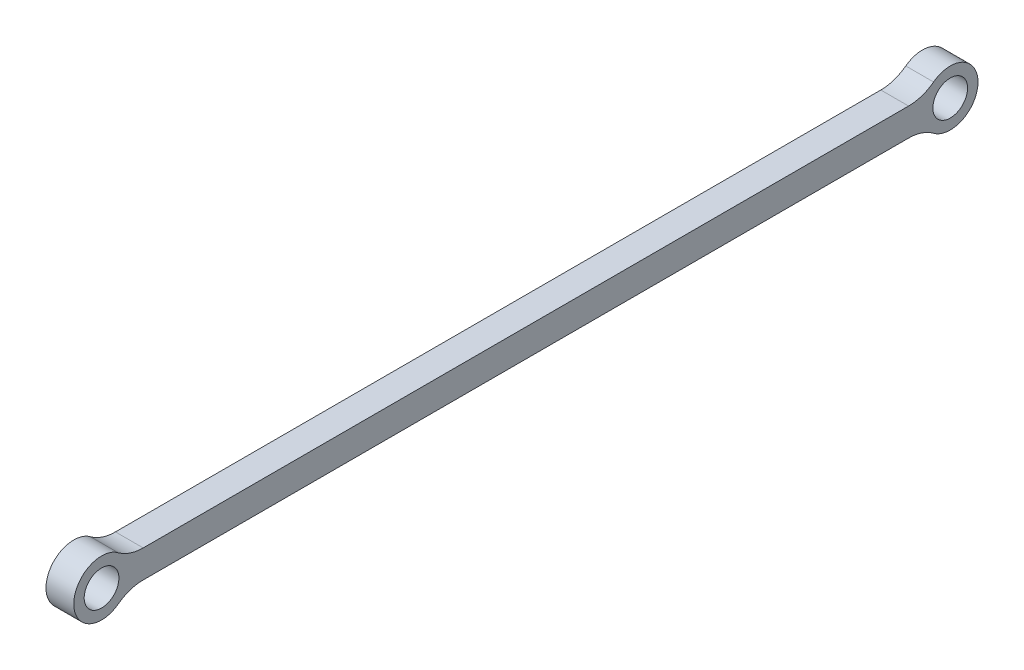
ISO-10303-21;
HEADER;
FILE_DESCRIPTION(('STEP AP214'),'2;1');
FILE_NAME('part.step','',(''),(''),'','','');
FILE_SCHEMA(('AUTOMOTIVE_DESIGN { 1 0 10303 214 1 1 1 1 }'));
ENDSEC;
DATA;
#1=APPLICATION_CONTEXT('core data for automotive mechanical design processes');
#2=APPLICATION_PROTOCOL_DEFINITION('international standard','automotive_design',2000,#1);
#3=PRODUCT_CONTEXT('',#1,'mechanical');
#4=PRODUCT('Part','Part','',(#3));
#5=PRODUCT_RELATED_PRODUCT_CATEGORY('part','',(#4));
#6=PRODUCT_DEFINITION_FORMATION('','',#4);
#7=PRODUCT_DEFINITION_CONTEXT('part definition',#1,'design');
#8=PRODUCT_DEFINITION('design','',#6,#7);
#9=PRODUCT_DEFINITION_SHAPE('','',#8);
#10=(LENGTH_UNIT() NAMED_UNIT(*) SI_UNIT(.MILLI.,.METRE.));
#11=(NAMED_UNIT(*) PLANE_ANGLE_UNIT() SI_UNIT($,.RADIAN.));
#12=(NAMED_UNIT(*) SI_UNIT($,.STERADIAN.) SOLID_ANGLE_UNIT());
#13=UNCERTAINTY_MEASURE_WITH_UNIT(LENGTH_MEASURE(1.E-05),#10,'distance_accuracy_value','');
#14=(GEOMETRIC_REPRESENTATION_CONTEXT(3) GLOBAL_UNCERTAINTY_ASSIGNED_CONTEXT((#13)) GLOBAL_UNIT_ASSIGNED_CONTEXT((#10,
#11,#12)) REPRESENTATION_CONTEXT('',''));
#15=CARTESIAN_POINT('',(0.,0.,0.));
#16=DIRECTION('',(0.,0.,1.));
#17=DIRECTION('',(1.,0.,0.));
#18=AXIS2_PLACEMENT_3D('',#15,#16,#17);
#19=CARTESIAN_POINT('',(8.,0.,0.));
#20=DIRECTION('',(1.,0.,0.));
#21=DIRECTION('',(0.,0.,-1.));
#22=AXIS2_PLACEMENT_3D('',#19,#20,#21);
#23=PLANE('',#22);
#24=DIRECTION('',(0.,0.,-1.));
#25=VECTOR('',#24,1.);
#26=CARTESIAN_POINT('',(8.,4.,-237.571796769724));
#27=LINE('',#26,#25);
#28=CARTESIAN_POINT('',(8.,3.99999999999997,-12.));
#29=VERTEX_POINT('',#28);
#30=CARTESIAN_POINT('',(8.,4.,-232.5));
#31=VERTEX_POINT('',#30);
#32=EDGE_CURVE('E129',#29,#31,#27,.T.);
#33=ORIENTED_EDGE('',*,*,#32,.F.);
#34=CARTESIAN_POINT('',(8.,16.,-12.));
#35=DIRECTION('',(1.,0.,0.));
#36=DIRECTION('',(0.,0.,-1.));
#37=AXIS2_PLACEMENT_3D('',#34,#35,#36);
#38=CIRCLE('',#37,12.);
#39=CARTESIAN_POINT('',(8.,6.39999999999999,-4.80000000000001));
#40=VERTEX_POINT('',#39);
#41=EDGE_CURVE('E58',#29,#40,#38,.F.);
#42=ORIENTED_EDGE('',*,*,#41,.T.);
#43=CARTESIAN_POINT('',(8.,0.,0.));
#44=DIRECTION('',(1.,0.,0.));
#45=DIRECTION('',(0.,0.,-1.));
#46=AXIS2_PLACEMENT_3D('',#43,#44,#45);
#47=CIRCLE('',#46,8.);
#48=CARTESIAN_POINT('',(8.,-6.39999999999999,-4.80000000000001));
#49=VERTEX_POINT('',#48);
#50=EDGE_CURVE('E146',#40,#49,#47,.T.);
#51=ORIENTED_EDGE('',*,*,#50,.T.);
#52=CARTESIAN_POINT('',(8.,-16.,-12.));
#53=DIRECTION('',(1.,0.,0.));
#54=DIRECTION('',(0.,0.,-1.));
#55=AXIS2_PLACEMENT_3D('',#52,#53,#54);
#56=CIRCLE('',#55,12.);
#57=CARTESIAN_POINT('',(8.,-3.99999999999997,-12.));
#58=VERTEX_POINT('',#57);
#59=EDGE_CURVE('E50',#49,#58,#56,.F.);
#60=ORIENTED_EDGE('',*,*,#59,.T.);
#61=DIRECTION('',(0.,0.,1.));
#62=VECTOR('',#61,1.);
#63=CARTESIAN_POINT('',(8.,-4.,-237.571796769724));
#64=LINE('',#63,#62);
#65=CARTESIAN_POINT('',(8.,-4.,-232.5));
#66=VERTEX_POINT('',#65);
#67=EDGE_CURVE('E117',#66,#58,#64,.T.);
#68=ORIENTED_EDGE('',*,*,#67,.F.);
#69=CARTESIAN_POINT('',(8.,-16.,-232.5));
#70=DIRECTION('',(1.,0.,0.));
#71=DIRECTION('',(0.,0.,-1.));
#72=AXIS2_PLACEMENT_3D('',#69,#70,#71);
#73=CIRCLE('',#72,12.);
#74=CARTESIAN_POINT('',(8.,-6.4,-239.7));
#75=VERTEX_POINT('',#74);
#76=EDGE_CURVE('E101',#66,#75,#73,.F.);
#77=ORIENTED_EDGE('',*,*,#76,.T.);
#78=CARTESIAN_POINT('',(8.,0.,-244.5));
#79=DIRECTION('',(1.,0.,0.));
#80=DIRECTION('',(0.,0.,-1.));
#81=AXIS2_PLACEMENT_3D('',#78,#79,#80);
#82=CIRCLE('',#81,8.);
#83=CARTESIAN_POINT('',(8.,6.4,-239.7));
#84=VERTEX_POINT('',#83);
#85=EDGE_CURVE('E148',#75,#84,#82,.T.);
#86=ORIENTED_EDGE('',*,*,#85,.T.);
#87=CARTESIAN_POINT('',(8.,16.,-232.5));
#88=DIRECTION('',(1.,0.,0.));
#89=DIRECTION('',(0.,0.,-1.));
#90=AXIS2_PLACEMENT_3D('',#87,#88,#89);
#91=CIRCLE('',#90,12.);
#92=EDGE_CURVE('E43',#84,#31,#91,.F.);
#93=ORIENTED_EDGE('',*,*,#92,.T.);
#94=EDGE_LOOP('',(#33,#42,#51,#60,#68,#77,#86,#93));
#95=FACE_BOUND('',#94,.T.);
#96=CARTESIAN_POINT('',(8.,0.,-244.5));
#97=DIRECTION('',(1.,0.,0.));
#98=DIRECTION('',(0.,0.,-1.));
#99=AXIS2_PLACEMENT_3D('',#96,#97,#98);
#100=CIRCLE('',#99,4.99999999999999);
#101=CARTESIAN_POINT('',(8.,0.,-249.5));
#102=VERTEX_POINT('',#101);
#103=EDGE_CURVE('E140',#102,#102,#100,.T.);
#104=ORIENTED_EDGE('',*,*,#103,.F.);
#105=EDGE_LOOP('',(#104));
#106=FACE_BOUND('',#105,.T.);
#107=CARTESIAN_POINT('',(8.,0.,0.));
#108=DIRECTION('',(1.,0.,0.));
#109=DIRECTION('',(0.,0.,-1.));
#110=AXIS2_PLACEMENT_3D('',#107,#108,#109);
#111=CIRCLE('',#110,5.);
#112=CARTESIAN_POINT('',(8.,0.,-5.));
#113=VERTEX_POINT('',#112);
#114=EDGE_CURVE('E134',#113,#113,#111,.T.);
#115=ORIENTED_EDGE('',*,*,#114,.F.);
#116=EDGE_LOOP('',(#115));
#117=FACE_BOUND('',#116,.T.);
#118=ADVANCED_FACE('F35',(#95,#106,#117),#23,.T.);
#119=CARTESIAN_POINT('',(0.,0.,0.));
#120=DIRECTION('',(1.,0.,0.));
#121=DIRECTION('',(0.,0.,-1.));
#122=AXIS2_PLACEMENT_3D('',#119,#120,#121);
#123=PLANE('',#122);
#124=CARTESIAN_POINT('',(0.,0.,-244.5));
#125=DIRECTION('',(1.,0.,0.));
#126=DIRECTION('',(0.,0.,-1.));
#127=AXIS2_PLACEMENT_3D('',#124,#125,#126);
#128=CIRCLE('',#127,8.);
#129=CARTESIAN_POINT('',(0.,-6.4,-239.7));
#130=VERTEX_POINT('',#129);
#131=CARTESIAN_POINT('',(0.,6.4,-239.7));
#132=VERTEX_POINT('',#131);
#133=EDGE_CURVE('E149',#130,#132,#128,.T.);
#134=ORIENTED_EDGE('',*,*,#133,.F.);
#135=CARTESIAN_POINT('',(0.,-16.,-232.5));
#136=DIRECTION('',(1.,0.,0.));
#137=DIRECTION('',(0.,0.,-1.));
#138=AXIS2_PLACEMENT_3D('',#135,#136,#137);
#139=CIRCLE('',#138,12.);
#140=CARTESIAN_POINT('',(0.,-4.,-232.5));
#141=VERTEX_POINT('',#140);
#142=EDGE_CURVE('E110',#130,#141,#139,.T.);
#143=ORIENTED_EDGE('',*,*,#142,.T.);
#144=DIRECTION('',(0.,0.,1.));
#145=VECTOR('',#144,1.);
#146=CARTESIAN_POINT('',(0.,-4.,-237.571796769724));
#147=LINE('',#146,#145);
#148=CARTESIAN_POINT('',(0.,-3.99999999999997,-12.));
#149=VERTEX_POINT('',#148);
#150=EDGE_CURVE('E119',#141,#149,#147,.T.);
#151=ORIENTED_EDGE('',*,*,#150,.T.);
#152=CARTESIAN_POINT('',(0.,-16.,-12.));
#153=DIRECTION('',(1.,0.,0.));
#154=DIRECTION('',(0.,0.,-1.));
#155=AXIS2_PLACEMENT_3D('',#152,#153,#154);
#156=CIRCLE('',#155,12.);
#157=CARTESIAN_POINT('',(0.,-6.39999999999999,-4.80000000000001));
#158=VERTEX_POINT('',#157);
#159=EDGE_CURVE('E172',#149,#158,#156,.T.);
#160=ORIENTED_EDGE('',*,*,#159,.T.);
#161=CARTESIAN_POINT('',(0.,0.,0.));
#162=DIRECTION('',(1.,0.,0.));
#163=DIRECTION('',(0.,0.,-1.));
#164=AXIS2_PLACEMENT_3D('',#161,#162,#163);
#165=CIRCLE('',#164,8.);
#166=CARTESIAN_POINT('',(0.,6.39999999999999,-4.80000000000001));
#167=VERTEX_POINT('',#166);
#168=EDGE_CURVE('E143',#167,#158,#165,.T.);
#169=ORIENTED_EDGE('',*,*,#168,.F.);
#170=CARTESIAN_POINT('',(0.,16.,-12.));
#171=DIRECTION('',(1.,0.,0.));
#172=DIRECTION('',(0.,0.,-1.));
#173=AXIS2_PLACEMENT_3D('',#170,#171,#172);
#174=CIRCLE('',#173,12.);
#175=CARTESIAN_POINT('',(0.,3.99999999999997,-12.));
#176=VERTEX_POINT('',#175);
#177=EDGE_CURVE('E169',#167,#176,#174,.T.);
#178=ORIENTED_EDGE('',*,*,#177,.T.);
#179=DIRECTION('',(0.,0.,-1.));
#180=VECTOR('',#179,1.);
#181=CARTESIAN_POINT('',(0.,4.,-237.571796769724));
#182=LINE('',#181,#180);
#183=CARTESIAN_POINT('',(0.,4.,-232.5));
#184=VERTEX_POINT('',#183);
#185=EDGE_CURVE('E124',#176,#184,#182,.T.);
#186=ORIENTED_EDGE('',*,*,#185,.T.);
#187=CARTESIAN_POINT('',(0.,16.,-232.5));
#188=DIRECTION('',(1.,0.,0.));
#189=DIRECTION('',(0.,0.,-1.));
#190=AXIS2_PLACEMENT_3D('',#187,#188,#189);
#191=CIRCLE('',#190,12.);
#192=EDGE_CURVE('E11',#184,#132,#191,.T.);
#193=ORIENTED_EDGE('',*,*,#192,.T.);
#194=EDGE_LOOP('',(#134,#143,#151,#160,#169,#178,#186,#193));
#195=FACE_BOUND('',#194,.T.);
#196=CARTESIAN_POINT('',(0.,0.,-244.5));
#197=DIRECTION('',(1.,0.,0.));
#198=DIRECTION('',(0.,0.,-1.));
#199=AXIS2_PLACEMENT_3D('',#196,#197,#198);
#200=CIRCLE('',#199,4.99999999999999);
#201=CARTESIAN_POINT('',(0.,0.,-249.5));
#202=VERTEX_POINT('',#201);
#203=EDGE_CURVE('E137',#202,#202,#200,.T.);
#204=ORIENTED_EDGE('',*,*,#203,.T.);
#205=EDGE_LOOP('',(#204));
#206=FACE_BOUND('',#205,.T.);
#207=CARTESIAN_POINT('',(0.,0.,0.));
#208=DIRECTION('',(1.,0.,0.));
#209=DIRECTION('',(0.,0.,-1.));
#210=AXIS2_PLACEMENT_3D('',#207,#208,#209);
#211=CIRCLE('',#210,5.);
#212=CARTESIAN_POINT('',(0.,0.,-5.));
#213=VERTEX_POINT('',#212);
#214=EDGE_CURVE('E126',#213,#213,#211,.T.);
#215=ORIENTED_EDGE('',*,*,#214,.T.);
#216=EDGE_LOOP('',(#215));
#217=FACE_BOUND('',#216,.T.);
#218=ADVANCED_FACE('F183',(#195,#206,#217),#123,.F.);
#219=CARTESIAN_POINT('',(8.,0.,0.));
#220=DIRECTION('',(-1.,0.,0.));
#221=DIRECTION('',(0.,0.,1.));
#222=AXIS2_PLACEMENT_3D('',#219,#220,#221);
#223=CYLINDRICAL_SURFACE('',#222,8.);
#224=ORIENTED_EDGE('',*,*,#50,.F.);
#225=DIRECTION('',(-1.,0.,0.));
#226=VECTOR('',#225,1.);
#227=CARTESIAN_POINT('',(8.,6.39999999999999,-4.80000000000001));
#228=LINE('',#227,#226);
#229=EDGE_CURVE('E111',#40,#167,#228,.T.);
#230=ORIENTED_EDGE('',*,*,#229,.T.);
#231=ORIENTED_EDGE('',*,*,#168,.T.);
#232=DIRECTION('',(-1.,0.,0.));
#233=VECTOR('',#232,1.);
#234=CARTESIAN_POINT('',(8.,-6.39999999999999,-4.80000000000001));
#235=LINE('',#234,#233);
#236=EDGE_CURVE('E164',#158,#49,#235,.F.);
#237=ORIENTED_EDGE('',*,*,#236,.T.);
#238=EDGE_LOOP('',(#224,#230,#231,#237));
#239=FACE_BOUND('',#238,.T.);
#240=ADVANCED_FACE('F189',(#239),#223,.T.);
#241=CARTESIAN_POINT('',(8.,0.,-244.5));
#242=DIRECTION('',(-1.,0.,0.));
#243=DIRECTION('',(0.,0.,1.));
#244=AXIS2_PLACEMENT_3D('',#241,#242,#243);
#245=CYLINDRICAL_SURFACE('',#244,8.);
#246=ORIENTED_EDGE('',*,*,#85,.F.);
#247=DIRECTION('',(-1.,0.,0.));
#248=VECTOR('',#247,1.);
#249=CARTESIAN_POINT('',(8.,-6.4,-239.7));
#250=LINE('',#249,#248);
#251=EDGE_CURVE('E106',#75,#130,#250,.T.);
#252=ORIENTED_EDGE('',*,*,#251,.T.);
#253=ORIENTED_EDGE('',*,*,#133,.T.);
#254=DIRECTION('',(-1.,0.,0.));
#255=VECTOR('',#254,1.);
#256=CARTESIAN_POINT('',(8.,6.4,-239.7));
#257=LINE('',#256,#255);
#258=EDGE_CURVE('E120',#132,#84,#257,.F.);
#259=ORIENTED_EDGE('',*,*,#258,.T.);
#260=EDGE_LOOP('',(#246,#252,#253,#259));
#261=FACE_BOUND('',#260,.T.);
#262=ADVANCED_FACE('F186',(#261),#245,.T.);
#263=CARTESIAN_POINT('',(8.,0.,-244.5));
#264=DIRECTION('',(-1.,0.,0.));
#265=DIRECTION('',(0.,0.,1.));
#266=AXIS2_PLACEMENT_3D('',#263,#264,#265);
#267=CYLINDRICAL_SURFACE('',#266,4.99999999999999);
#268=ORIENTED_EDGE('',*,*,#103,.T.);
#269=EDGE_LOOP('',(#268));
#270=FACE_BOUND('',#269,.T.);
#271=ORIENTED_EDGE('',*,*,#203,.F.);
#272=EDGE_LOOP('',(#271));
#273=FACE_BOUND('',#272,.T.);
#274=ADVANCED_FACE('F188',(#270,#273),#267,.F.);
#275=CARTESIAN_POINT('',(8.,0.,0.));
#276=DIRECTION('',(-1.,0.,0.));
#277=DIRECTION('',(0.,0.,1.));
#278=AXIS2_PLACEMENT_3D('',#275,#276,#277);
#279=CYLINDRICAL_SURFACE('',#278,5.);
#280=ORIENTED_EDGE('',*,*,#114,.T.);
#281=EDGE_LOOP('',(#280));
#282=FACE_BOUND('',#281,.T.);
#283=ORIENTED_EDGE('',*,*,#214,.F.);
#284=EDGE_LOOP('',(#283));
#285=FACE_BOUND('',#284,.T.);
#286=ADVANCED_FACE('F195',(#282,#285),#279,.F.);
#287=CARTESIAN_POINT('',(0.,4.,-237.571796769724));
#288=DIRECTION('',(0.,-1.,0.));
#289=DIRECTION('',(0.,0.,-1.));
#290=AXIS2_PLACEMENT_3D('',#287,#288,#289);
#291=PLANE('',#290);
#292=ORIENTED_EDGE('',*,*,#185,.F.);
#293=DIRECTION('',(1.,0.,0.));
#294=VECTOR('',#293,1.);
#295=CARTESIAN_POINT('',(8.,3.99999999999997,-12.));
#296=LINE('',#295,#294);
#297=EDGE_CURVE('E161',#176,#29,#296,.T.);
#298=ORIENTED_EDGE('',*,*,#297,.T.);
#299=ORIENTED_EDGE('',*,*,#32,.T.);
#300=DIRECTION('',(1.,0.,0.));
#301=VECTOR('',#300,1.);
#302=CARTESIAN_POINT('',(0.,4.,-232.5));
#303=LINE('',#302,#301);
#304=EDGE_CURVE('E159',#31,#184,#303,.F.);
#305=ORIENTED_EDGE('',*,*,#304,.T.);
#306=EDGE_LOOP('',(#292,#298,#299,#305));
#307=FACE_BOUND('',#306,.T.);
#308=ADVANCED_FACE('F178',(#307),#291,.F.);
#309=CARTESIAN_POINT('',(0.,-4.,-237.571796769724));
#310=DIRECTION('',(0.,1.,0.));
#311=DIRECTION('',(0.,0.,1.));
#312=AXIS2_PLACEMENT_3D('',#309,#310,#311);
#313=PLANE('',#312);
#314=ORIENTED_EDGE('',*,*,#150,.F.);
#315=DIRECTION('',(1.,0.,0.));
#316=VECTOR('',#315,1.);
#317=CARTESIAN_POINT('',(8.,-4.,-232.5));
#318=LINE('',#317,#316);
#319=EDGE_CURVE('E105',#141,#66,#318,.T.);
#320=ORIENTED_EDGE('',*,*,#319,.T.);
#321=ORIENTED_EDGE('',*,*,#67,.T.);
#322=DIRECTION('',(1.,0.,0.));
#323=VECTOR('',#322,1.);
#324=CARTESIAN_POINT('',(0.,-3.99999999999997,-12.));
#325=LINE('',#324,#323);
#326=EDGE_CURVE('E121',#58,#149,#325,.F.);
#327=ORIENTED_EDGE('',*,*,#326,.T.);
#328=EDGE_LOOP('',(#314,#320,#321,#327));
#329=FACE_BOUND('',#328,.T.);
#330=ADVANCED_FACE('F116',(#329),#313,.F.);
#331=CARTESIAN_POINT('',(8.,-16.,-232.5));
#332=DIRECTION('',(-1.,0.,0.));
#333=DIRECTION('',(0.,0.,1.));
#334=AXIS2_PLACEMENT_3D('',#331,#332,#333);
#335=CYLINDRICAL_SURFACE('',#334,12.);
#336=ORIENTED_EDGE('',*,*,#142,.F.);
#337=ORIENTED_EDGE('',*,*,#251,.F.);
#338=ORIENTED_EDGE('',*,*,#76,.F.);
#339=ORIENTED_EDGE('',*,*,#319,.F.);
#340=EDGE_LOOP('',(#336,#337,#338,#339));
#341=FACE_BOUND('',#340,.T.);
#342=ADVANCED_FACE('F104',(#341),#335,.F.);
#343=CARTESIAN_POINT('',(8.,16.,-12.));
#344=DIRECTION('',(-1.,0.,0.));
#345=DIRECTION('',(0.,0.,1.));
#346=AXIS2_PLACEMENT_3D('',#343,#344,#345);
#347=CYLINDRICAL_SURFACE('',#346,12.);
#348=ORIENTED_EDGE('',*,*,#177,.F.);
#349=ORIENTED_EDGE('',*,*,#229,.F.);
#350=ORIENTED_EDGE('',*,*,#41,.F.);
#351=ORIENTED_EDGE('',*,*,#297,.F.);
#352=EDGE_LOOP('',(#348,#349,#350,#351));
#353=FACE_BOUND('',#352,.T.);
#354=ADVANCED_FACE('F216',(#353),#347,.F.);
#355=CARTESIAN_POINT('',(8.,-16.,-12.));
#356=DIRECTION('',(-1.,0.,0.));
#357=DIRECTION('',(0.,0.,1.));
#358=AXIS2_PLACEMENT_3D('',#355,#356,#357);
#359=CYLINDRICAL_SURFACE('',#358,12.);
#360=ORIENTED_EDGE('',*,*,#159,.F.);
#361=ORIENTED_EDGE('',*,*,#326,.F.);
#362=ORIENTED_EDGE('',*,*,#59,.F.);
#363=ORIENTED_EDGE('',*,*,#236,.F.);
#364=EDGE_LOOP('',(#360,#361,#362,#363));
#365=FACE_BOUND('',#364,.T.);
#366=ADVANCED_FACE('F221',(#365),#359,.F.);
#367=CARTESIAN_POINT('',(8.,16.,-232.5));
#368=DIRECTION('',(-1.,0.,0.));
#369=DIRECTION('',(0.,0.,1.));
#370=AXIS2_PLACEMENT_3D('',#367,#368,#369);
#371=CYLINDRICAL_SURFACE('',#370,12.);
#372=ORIENTED_EDGE('',*,*,#192,.F.);
#373=ORIENTED_EDGE('',*,*,#304,.F.);
#374=ORIENTED_EDGE('',*,*,#92,.F.);
#375=ORIENTED_EDGE('',*,*,#258,.F.);
#376=EDGE_LOOP('',(#372,#373,#374,#375));
#377=FACE_BOUND('',#376,.T.);
#378=ADVANCED_FACE('F37',(#377),#371,.F.);
#379=CLOSED_SHELL('',(#118,#218,#240,#262,#274,#286,#308,#330,#342,#354,#366,#378));
#380=MANIFOLD_SOLID_BREP('B2',#379);
#381=ADVANCED_BREP_SHAPE_REPRESENTATION('',(#18,#380),#14);
#382=SHAPE_DEFINITION_REPRESENTATION(#9,#381);
ENDSEC;
END-ISO-10303-21;
